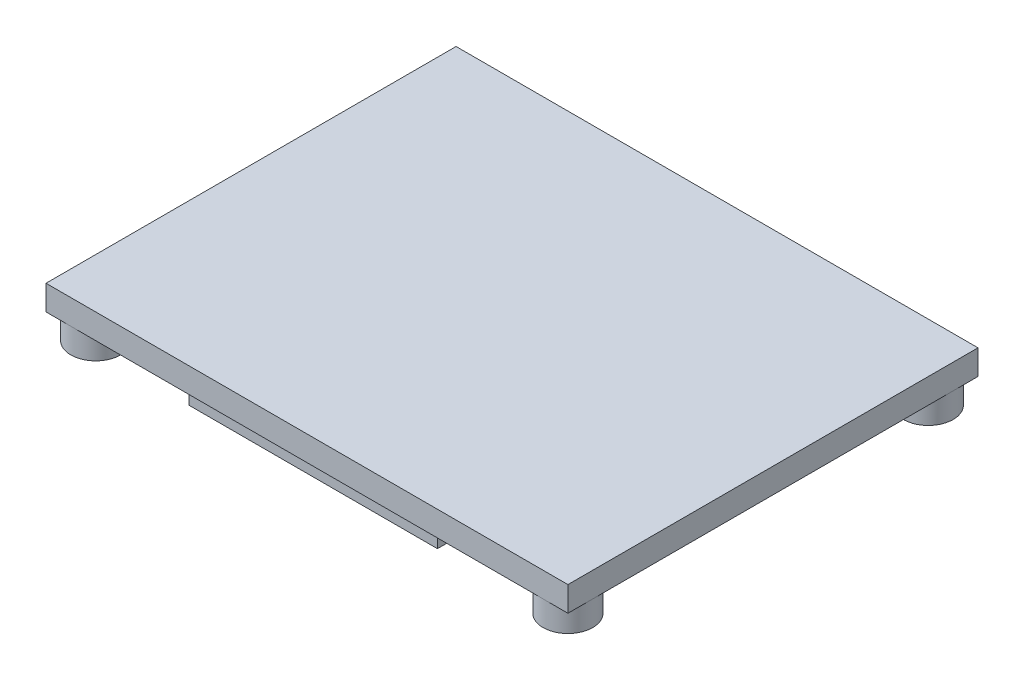
ISO-10303-21;
HEADER;
FILE_DESCRIPTION(('STEP AP214'),'2;1');
FILE_NAME('part.step','',(''),(''),'','','');
FILE_SCHEMA(('AUTOMOTIVE_DESIGN { 1 0 10303 214 1 1 1 1 }'));
ENDSEC;
DATA;
#1=APPLICATION_CONTEXT('core data for automotive mechanical design processes');
#2=APPLICATION_PROTOCOL_DEFINITION('international standard','automotive_design',2000,#1);
#3=PRODUCT_CONTEXT('',#1,'mechanical');
#4=PRODUCT('Part','Part','',(#3));
#5=PRODUCT_RELATED_PRODUCT_CATEGORY('part','',(#4));
#6=PRODUCT_DEFINITION_FORMATION('','',#4);
#7=PRODUCT_DEFINITION_CONTEXT('part definition',#1,'design');
#8=PRODUCT_DEFINITION('design','',#6,#7);
#9=PRODUCT_DEFINITION_SHAPE('','',#8);
#10=(LENGTH_UNIT() NAMED_UNIT(*) SI_UNIT(.MILLI.,.METRE.));
#11=(NAMED_UNIT(*) PLANE_ANGLE_UNIT() SI_UNIT($,.RADIAN.));
#12=(NAMED_UNIT(*) SI_UNIT($,.STERADIAN.) SOLID_ANGLE_UNIT());
#13=UNCERTAINTY_MEASURE_WITH_UNIT(LENGTH_MEASURE(1.E-05),#10,'distance_accuracy_value','');
#14=(GEOMETRIC_REPRESENTATION_CONTEXT(3) GLOBAL_UNCERTAINTY_ASSIGNED_CONTEXT((#13)) GLOBAL_UNIT_ASSIGNED_CONTEXT((#10,
#11,#12)) REPRESENTATION_CONTEXT('',''));
#15=CARTESIAN_POINT('',(0.,0.,0.));
#16=DIRECTION('',(0.,0.,1.));
#17=DIRECTION('',(1.,0.,0.));
#18=AXIS2_PLACEMENT_3D('',#15,#16,#17);
#19=CARTESIAN_POINT('',(0.,0.,0.));
#20=DIRECTION('',(0.,-1.,0.));
#21=DIRECTION('',(0.,0.,-1.));
#22=AXIS2_PLACEMENT_3D('',#19,#20,#21);
#23=PLANE('',#22);
#24=DIRECTION('',(-1.,0.,0.));
#25=VECTOR('',#24,1.);
#26=CARTESIAN_POINT('',(0.,0.,-660.));
#27=LINE('',#26,#25);
#28=CARTESIAN_POINT('',(800.,0.,-660.));
#29=VERTEX_POINT('',#28);
#30=CARTESIAN_POINT('',(40.,0.,-660.));
#31=VERTEX_POINT('',#30);
#32=EDGE_CURVE('E230',#29,#31,#27,.T.);
#33=ORIENTED_EDGE('',*,*,#32,.F.);
#34=CARTESIAN_POINT('',(800.,0.,-620.));
#35=DIRECTION('',(0.,-1.,0.));
#36=DIRECTION('',(0.,0.,-1.));
#37=AXIS2_PLACEMENT_3D('',#34,#35,#36);
#38=CIRCLE('',#37,40.);
#39=CARTESIAN_POINT('',(840.,0.,-620.));
#40=VERTEX_POINT('',#39);
#41=EDGE_CURVE('E11',#29,#40,#38,.F.);
#42=ORIENTED_EDGE('',*,*,#41,.T.);
#43=DIRECTION('',(0.,0.,-1.));
#44=VECTOR('',#43,1.);
#45=CARTESIAN_POINT('',(840.,0.,0.));
#46=LINE('',#45,#44);
#47=CARTESIAN_POINT('',(840.,0.,-40.));
#48=VERTEX_POINT('',#47);
#49=EDGE_CURVE('E226',#48,#40,#46,.T.);
#50=ORIENTED_EDGE('',*,*,#49,.F.);
#51=CARTESIAN_POINT('',(800.,0.,-40.));
#52=DIRECTION('',(0.,-1.,0.));
#53=DIRECTION('',(0.,0.,-1.));
#54=AXIS2_PLACEMENT_3D('',#51,#52,#53);
#55=CIRCLE('',#54,40.);
#56=CARTESIAN_POINT('',(800.,0.,0.));
#57=VERTEX_POINT('',#56);
#58=EDGE_CURVE('E246',#48,#57,#55,.F.);
#59=ORIENTED_EDGE('',*,*,#58,.T.);
#60=DIRECTION('',(1.,0.,0.));
#61=VECTOR('',#60,1.);
#62=CARTESIAN_POINT('',(0.,0.,0.));
#63=LINE('',#62,#61);
#64=CARTESIAN_POINT('',(40.,0.,0.));
#65=VERTEX_POINT('',#64);
#66=EDGE_CURVE('E220',#65,#57,#63,.T.);
#67=ORIENTED_EDGE('',*,*,#66,.F.);
#68=CARTESIAN_POINT('',(40.,0.,-40.));
#69=DIRECTION('',(0.,-1.,0.));
#70=DIRECTION('',(0.,0.,-1.));
#71=AXIS2_PLACEMENT_3D('',#68,#69,#70);
#72=CIRCLE('',#71,40.);
#73=CARTESIAN_POINT('',(0.,0.,-40.));
#74=VERTEX_POINT('',#73);
#75=EDGE_CURVE('E194',#74,#65,#72,.T.);
#76=ORIENTED_EDGE('',*,*,#75,.F.);
#77=DIRECTION('',(0.,0.,1.));
#78=VECTOR('',#77,1.);
#79=CARTESIAN_POINT('',(0.,0.,0.));
#80=LINE('',#79,#78);
#81=CARTESIAN_POINT('',(0.,0.,-620.));
#82=VERTEX_POINT('',#81);
#83=EDGE_CURVE('E215',#82,#74,#80,.T.);
#84=ORIENTED_EDGE('',*,*,#83,.F.);
#85=CARTESIAN_POINT('',(40.,0.,-620.));
#86=DIRECTION('',(0.,-1.,0.));
#87=DIRECTION('',(0.,0.,-1.));
#88=AXIS2_PLACEMENT_3D('',#85,#86,#87);
#89=CIRCLE('',#88,40.);
#90=EDGE_CURVE('E172',#31,#82,#89,.T.);
#91=ORIENTED_EDGE('',*,*,#90,.F.);
#92=EDGE_LOOP('',(#33,#42,#50,#59,#67,#76,#84,#91));
#93=FACE_BOUND('',#92,.T.);
#94=DIRECTION('',(0.,0.,-1.));
#95=VECTOR('',#94,1.);
#96=CARTESIAN_POINT('',(220.,0.,-10.));
#97=LINE('',#96,#95);
#98=CARTESIAN_POINT('',(220.,0.,-10.));
#99=VERTEX_POINT('',#98);
#100=CARTESIAN_POINT('',(220.,0.,-650.));
#101=VERTEX_POINT('',#100);
#102=EDGE_CURVE('E542',#99,#101,#97,.T.);
#103=ORIENTED_EDGE('',*,*,#102,.F.);
#104=DIRECTION('',(-1.,0.,0.));
#105=VECTOR('',#104,1.);
#106=CARTESIAN_POINT('',(220.,0.,-10.));
#107=LINE('',#106,#105);
#108=CARTESIAN_POINT('',(620.,0.,-9.99999999999995));
#109=VERTEX_POINT('',#108);
#110=EDGE_CURVE('E156',#109,#99,#107,.T.);
#111=ORIENTED_EDGE('',*,*,#110,.F.);
#112=DIRECTION('',(0.,0.,1.));
#113=VECTOR('',#112,1.);
#114=CARTESIAN_POINT('',(620.,0.,-9.99999999999995));
#115=LINE('',#114,#113);
#116=CARTESIAN_POINT('',(620.,0.,-650.));
#117=VERTEX_POINT('',#116);
#118=EDGE_CURVE('E152',#117,#109,#115,.T.);
#119=ORIENTED_EDGE('',*,*,#118,.F.);
#120=DIRECTION('',(1.,0.,0.));
#121=VECTOR('',#120,1.);
#122=CARTESIAN_POINT('',(620.,0.,-650.));
#123=LINE('',#122,#121);
#124=EDGE_CURVE('E538',#101,#117,#123,.T.);
#125=ORIENTED_EDGE('',*,*,#124,.F.);
#126=EDGE_LOOP('',(#103,#111,#119,#125));
#127=FACE_BOUND('',#126,.T.);
#128=ADVANCED_FACE('F43',(#93,#127),#23,.T.);
#129=CARTESIAN_POINT('',(0.,0.,-660.));
#130=VERTEX_POINT('',#129);
#131=EDGE_CURVE('E225',#31,#130,#27,.T.);
#132=ORIENTED_EDGE('',*,*,#131,.F.);
#133=CARTESIAN_POINT('',(40.,0.,-620.));
#134=DIRECTION('',(0.,-1.,0.));
#135=DIRECTION('',(0.,0.,-1.));
#136=AXIS2_PLACEMENT_3D('',#133,#134,#135);
#137=CIRCLE('',#136,40.);
#138=EDGE_CURVE('E52',#31,#82,#137,.F.);
#139=ORIENTED_EDGE('',*,*,#138,.T.);
#140=EDGE_CURVE('E210',#130,#82,#80,.T.);
#141=ORIENTED_EDGE('',*,*,#140,.F.);
#142=EDGE_LOOP('',(#132,#139,#141));
#143=FACE_BOUND('',#142,.T.);
#144=ADVANCED_FACE('F256',(#143),#23,.T.);
#145=CARTESIAN_POINT('',(840.,0.,0.));
#146=VERTEX_POINT('',#145);
#147=EDGE_CURVE('E214',#57,#146,#63,.T.);
#148=ORIENTED_EDGE('',*,*,#147,.F.);
#149=CARTESIAN_POINT('',(800.,0.,-40.));
#150=DIRECTION('',(0.,-1.,0.));
#151=DIRECTION('',(0.,0.,-1.));
#152=AXIS2_PLACEMENT_3D('',#149,#150,#151);
#153=CIRCLE('',#152,40.);
#154=EDGE_CURVE('E179',#48,#57,#153,.T.);
#155=ORIENTED_EDGE('',*,*,#154,.F.);
#156=EDGE_CURVE('E221',#146,#48,#46,.T.);
#157=ORIENTED_EDGE('',*,*,#156,.F.);
#158=EDGE_LOOP('',(#148,#155,#157));
#159=FACE_BOUND('',#158,.T.);
#160=ADVANCED_FACE('F308',(#159),#23,.T.);
#161=EDGE_CURVE('E182',#65,#74,#72,.T.);
#162=ORIENTED_EDGE('',*,*,#161,.F.);
#163=CARTESIAN_POINT('',(0.,0.,0.));
#164=VERTEX_POINT('',#163);
#165=EDGE_CURVE('E216',#164,#65,#63,.T.);
#166=ORIENTED_EDGE('',*,*,#165,.F.);
#167=EDGE_CURVE('E190',#74,#164,#80,.T.);
#168=ORIENTED_EDGE('',*,*,#167,.F.);
#169=EDGE_LOOP('',(#162,#166,#168));
#170=FACE_BOUND('',#169,.T.);
#171=ADVANCED_FACE('F282',(#170),#23,.T.);
#172=CARTESIAN_POINT('',(0.,40.,0.));
#173=DIRECTION('',(1.,0.,0.));
#174=DIRECTION('',(0.,0.,-1.));
#175=AXIS2_PLACEMENT_3D('',#172,#173,#174);
#176=PLANE('',#175);
#177=ORIENTED_EDGE('',*,*,#140,.T.);
#178=ORIENTED_EDGE('',*,*,#83,.T.);
#179=ORIENTED_EDGE('',*,*,#167,.T.);
#180=DIRECTION('',(0.,-1.,0.));
#181=VECTOR('',#180,1.);
#182=CARTESIAN_POINT('',(0.,40.,0.));
#183=LINE('',#182,#181);
#184=CARTESIAN_POINT('',(0.,40.,0.));
#185=VERTEX_POINT('',#184);
#186=EDGE_CURVE('E242',#185,#164,#183,.T.);
#187=ORIENTED_EDGE('',*,*,#186,.F.);
#188=DIRECTION('',(0.,0.,1.));
#189=VECTOR('',#188,1.);
#190=CARTESIAN_POINT('',(0.,40.,0.));
#191=LINE('',#190,#189);
#192=CARTESIAN_POINT('',(0.,40.,-660.));
#193=VERTEX_POINT('',#192);
#194=EDGE_CURVE('E195',#193,#185,#191,.T.);
#195=ORIENTED_EDGE('',*,*,#194,.F.);
#196=DIRECTION('',(0.,-1.,0.));
#197=VECTOR('',#196,1.);
#198=CARTESIAN_POINT('',(0.,40.,-660.));
#199=LINE('',#198,#197);
#200=EDGE_CURVE('E209',#193,#130,#199,.T.);
#201=ORIENTED_EDGE('',*,*,#200,.T.);
#202=EDGE_LOOP('',(#177,#178,#179,#187,#195,#201));
#203=FACE_BOUND('',#202,.T.);
#204=ADVANCED_FACE('F45',(#203),#176,.F.);
#205=CARTESIAN_POINT('',(0.,40.,0.));
#206=DIRECTION('',(0.,0.,-1.));
#207=DIRECTION('',(-1.,0.,0.));
#208=AXIS2_PLACEMENT_3D('',#205,#206,#207);
#209=PLANE('',#208);
#210=ORIENTED_EDGE('',*,*,#165,.T.);
#211=ORIENTED_EDGE('',*,*,#66,.T.);
#212=ORIENTED_EDGE('',*,*,#147,.T.);
#213=DIRECTION('',(0.,-1.,0.));
#214=VECTOR('',#213,1.);
#215=CARTESIAN_POINT('',(840.,40.,0.));
#216=LINE('',#215,#214);
#217=CARTESIAN_POINT('',(840.,40.,0.));
#218=VERTEX_POINT('',#217);
#219=EDGE_CURVE('E238',#218,#146,#216,.T.);
#220=ORIENTED_EDGE('',*,*,#219,.F.);
#221=DIRECTION('',(1.,0.,0.));
#222=VECTOR('',#221,1.);
#223=CARTESIAN_POINT('',(0.,40.,0.));
#224=LINE('',#223,#222);
#225=EDGE_CURVE('E199',#185,#218,#224,.T.);
#226=ORIENTED_EDGE('',*,*,#225,.F.);
#227=ORIENTED_EDGE('',*,*,#186,.T.);
#228=EDGE_LOOP('',(#210,#211,#212,#220,#226,#227));
#229=FACE_BOUND('',#228,.T.);
#230=ADVANCED_FACE('F305',(#229),#209,.F.);
#231=CARTESIAN_POINT('',(840.,40.,0.));
#232=DIRECTION('',(-1.,0.,0.));
#233=DIRECTION('',(0.,0.,1.));
#234=AXIS2_PLACEMENT_3D('',#231,#232,#233);
#235=PLANE('',#234);
#236=ORIENTED_EDGE('',*,*,#156,.T.);
#237=ORIENTED_EDGE('',*,*,#49,.T.);
#238=CARTESIAN_POINT('',(840.,0.,-660.));
#239=VERTEX_POINT('',#238);
#240=EDGE_CURVE('E219',#40,#239,#46,.T.);
#241=ORIENTED_EDGE('',*,*,#240,.T.);
#242=DIRECTION('',(0.,-1.,0.));
#243=VECTOR('',#242,1.);
#244=CARTESIAN_POINT('',(840.,40.,-660.));
#245=LINE('',#244,#243);
#246=CARTESIAN_POINT('',(840.,40.,-660.));
#247=VERTEX_POINT('',#246);
#248=EDGE_CURVE('E234',#247,#239,#245,.T.);
#249=ORIENTED_EDGE('',*,*,#248,.F.);
#250=DIRECTION('',(0.,0.,-1.));
#251=VECTOR('',#250,1.);
#252=CARTESIAN_POINT('',(840.,40.,0.));
#253=LINE('',#252,#251);
#254=EDGE_CURVE('E203',#218,#247,#253,.T.);
#255=ORIENTED_EDGE('',*,*,#254,.F.);
#256=ORIENTED_EDGE('',*,*,#219,.T.);
#257=EDGE_LOOP('',(#236,#237,#241,#249,#255,#256));
#258=FACE_BOUND('',#257,.T.);
#259=ADVANCED_FACE('F292',(#258),#235,.F.);
#260=CARTESIAN_POINT('',(0.,40.,-660.));
#261=DIRECTION('',(0.,0.,1.));
#262=DIRECTION('',(1.,0.,0.));
#263=AXIS2_PLACEMENT_3D('',#260,#261,#262);
#264=PLANE('',#263);
#265=EDGE_CURVE('E200',#239,#29,#27,.T.);
#266=ORIENTED_EDGE('',*,*,#265,.T.);
#267=ORIENTED_EDGE('',*,*,#32,.T.);
#268=ORIENTED_EDGE('',*,*,#131,.T.);
#269=ORIENTED_EDGE('',*,*,#200,.F.);
#270=DIRECTION('',(-1.,0.,0.));
#271=VECTOR('',#270,1.);
#272=CARTESIAN_POINT('',(0.,40.,-660.));
#273=LINE('',#272,#271);
#274=EDGE_CURVE('E206',#247,#193,#273,.T.);
#275=ORIENTED_EDGE('',*,*,#274,.F.);
#276=ORIENTED_EDGE('',*,*,#248,.T.);
#277=EDGE_LOOP('',(#266,#267,#268,#269,#275,#276));
#278=FACE_BOUND('',#277,.T.);
#279=ADVANCED_FACE('F273',(#278),#264,.F.);
#280=CARTESIAN_POINT('',(0.,40.,0.));
#281=DIRECTION('',(0.,-1.,0.));
#282=DIRECTION('',(0.,0.,-1.));
#283=AXIS2_PLACEMENT_3D('',#280,#281,#282);
#284=PLANE('',#283);
#285=ORIENTED_EDGE('',*,*,#194,.T.);
#286=ORIENTED_EDGE('',*,*,#225,.T.);
#287=ORIENTED_EDGE('',*,*,#254,.T.);
#288=ORIENTED_EDGE('',*,*,#274,.T.);
#289=EDGE_LOOP('',(#285,#286,#287,#288));
#290=FACE_BOUND('',#289,.T.);
#291=ADVANCED_FACE('F303',(#290),#284,.F.);
#292=ORIENTED_EDGE('',*,*,#240,.F.);
#293=CARTESIAN_POINT('',(800.,0.,-620.));
#294=DIRECTION('',(0.,-1.,0.));
#295=DIRECTION('',(0.,0.,-1.));
#296=AXIS2_PLACEMENT_3D('',#293,#294,#295);
#297=CIRCLE('',#296,40.);
#298=EDGE_CURVE('E164',#29,#40,#297,.T.);
#299=ORIENTED_EDGE('',*,*,#298,.F.);
#300=ORIENTED_EDGE('',*,*,#265,.F.);
#301=EDGE_LOOP('',(#292,#299,#300));
#302=FACE_BOUND('',#301,.T.);
#303=ADVANCED_FACE('F299',(#302),#23,.T.);
#304=CARTESIAN_POINT('',(40.,-40.,-40.));
#305=DIRECTION('',(0.,1.,0.));
#306=DIRECTION('',(0.,0.,1.));
#307=AXIS2_PLACEMENT_3D('',#304,#305,#306);
#308=CYLINDRICAL_SURFACE('',#307,40.);
#309=CARTESIAN_POINT('',(40.,-40.,-40.));
#310=DIRECTION('',(0.,-1.,0.));
#311=DIRECTION('',(0.,0.,-1.));
#312=AXIS2_PLACEMENT_3D('',#309,#310,#311);
#313=CIRCLE('',#312,40.);
#314=CARTESIAN_POINT('',(40.,-40.,-80.));
#315=VERTEX_POINT('',#314);
#316=EDGE_CURVE('E186',#315,#315,#313,.T.);
#317=ORIENTED_EDGE('',*,*,#316,.F.);
#318=EDGE_LOOP('',(#317));
#319=FACE_BOUND('',#318,.T.);
#320=ORIENTED_EDGE('',*,*,#161,.T.);
#321=ORIENTED_EDGE('',*,*,#75,.T.);
#322=EDGE_LOOP('',(#320,#321));
#323=FACE_BOUND('',#322,.T.);
#324=ADVANCED_FACE('F278',(#319,#323),#308,.T.);
#325=CARTESIAN_POINT('',(40.,-40.,-40.));
#326=DIRECTION('',(0.,-1.,0.));
#327=DIRECTION('',(0.,0.,-1.));
#328=AXIS2_PLACEMENT_3D('',#325,#326,#327);
#329=PLANE('',#328);
#330=ORIENTED_EDGE('',*,*,#316,.T.);
#331=EDGE_LOOP('',(#330));
#332=FACE_BOUND('',#331,.T.);
#333=ADVANCED_FACE('F313',(#332),#329,.T.);
#334=CARTESIAN_POINT('',(800.,-40.,-40.));
#335=DIRECTION('',(0.,1.,0.));
#336=DIRECTION('',(0.,0.,1.));
#337=AXIS2_PLACEMENT_3D('',#334,#335,#336);
#338=CYLINDRICAL_SURFACE('',#337,40.);
#339=CARTESIAN_POINT('',(800.,-40.,-40.));
#340=DIRECTION('',(0.,-1.,0.));
#341=DIRECTION('',(0.,0.,-1.));
#342=AXIS2_PLACEMENT_3D('',#339,#340,#341);
#343=CIRCLE('',#342,40.);
#344=CARTESIAN_POINT('',(800.,-40.,-80.));
#345=VERTEX_POINT('',#344);
#346=EDGE_CURVE('E175',#345,#345,#343,.T.);
#347=ORIENTED_EDGE('',*,*,#346,.F.);
#348=EDGE_LOOP('',(#347));
#349=FACE_BOUND('',#348,.T.);
#350=ORIENTED_EDGE('',*,*,#154,.T.);
#351=ORIENTED_EDGE('',*,*,#58,.F.);
#352=EDGE_LOOP('',(#350,#351));
#353=FACE_BOUND('',#352,.T.);
#354=ADVANCED_FACE('F310',(#349,#353),#338,.T.);
#355=CARTESIAN_POINT('',(800.,-40.,-40.));
#356=DIRECTION('',(0.,-1.,0.));
#357=DIRECTION('',(0.,0.,-1.));
#358=AXIS2_PLACEMENT_3D('',#355,#356,#357);
#359=PLANE('',#358);
#360=ORIENTED_EDGE('',*,*,#346,.T.);
#361=EDGE_LOOP('',(#360));
#362=FACE_BOUND('',#361,.T.);
#363=ADVANCED_FACE('F312',(#362),#359,.T.);
#364=CARTESIAN_POINT('',(40.,-40.,-620.));
#365=DIRECTION('',(0.,1.,0.));
#366=DIRECTION('',(0.,0.,1.));
#367=AXIS2_PLACEMENT_3D('',#364,#365,#366);
#368=CYLINDRICAL_SURFACE('',#367,40.);
#369=CARTESIAN_POINT('',(40.,-40.,-620.));
#370=DIRECTION('',(0.,-1.,0.));
#371=DIRECTION('',(0.,0.,-1.));
#372=AXIS2_PLACEMENT_3D('',#369,#370,#371);
#373=CIRCLE('',#372,40.);
#374=CARTESIAN_POINT('',(40.,-40.,-660.));
#375=VERTEX_POINT('',#374);
#376=EDGE_CURVE('E170',#375,#375,#373,.T.);
#377=ORIENTED_EDGE('',*,*,#376,.F.);
#378=EDGE_LOOP('',(#377));
#379=FACE_BOUND('',#378,.T.);
#380=ORIENTED_EDGE('',*,*,#90,.T.);
#381=ORIENTED_EDGE('',*,*,#138,.F.);
#382=EDGE_LOOP('',(#380,#381));
#383=FACE_BOUND('',#382,.T.);
#384=ADVANCED_FACE('F320',(#379,#383),#368,.T.);
#385=CARTESIAN_POINT('',(40.,-40.,-620.));
#386=DIRECTION('',(0.,-1.,0.));
#387=DIRECTION('',(0.,0.,-1.));
#388=AXIS2_PLACEMENT_3D('',#385,#386,#387);
#389=PLANE('',#388);
#390=ORIENTED_EDGE('',*,*,#376,.T.);
#391=EDGE_LOOP('',(#390));
#392=FACE_BOUND('',#391,.T.);
#393=ADVANCED_FACE('F435',(#392),#389,.T.);
#394=CARTESIAN_POINT('',(800.,-40.,-620.));
#395=DIRECTION('',(0.,1.,0.));
#396=DIRECTION('',(0.,0.,1.));
#397=AXIS2_PLACEMENT_3D('',#394,#395,#396);
#398=CYLINDRICAL_SURFACE('',#397,40.);
#399=CARTESIAN_POINT('',(800.,-40.,-620.));
#400=DIRECTION('',(0.,-1.,0.));
#401=DIRECTION('',(0.,0.,-1.));
#402=AXIS2_PLACEMENT_3D('',#399,#400,#401);
#403=CIRCLE('',#402,40.);
#404=CARTESIAN_POINT('',(800.,-40.,-660.));
#405=VERTEX_POINT('',#404);
#406=EDGE_CURVE('E159',#405,#405,#403,.T.);
#407=ORIENTED_EDGE('',*,*,#406,.F.);
#408=EDGE_LOOP('',(#407));
#409=FACE_BOUND('',#408,.T.);
#410=ORIENTED_EDGE('',*,*,#298,.T.);
#411=ORIENTED_EDGE('',*,*,#41,.F.);
#412=EDGE_LOOP('',(#410,#411));
#413=FACE_BOUND('',#412,.T.);
#414=ADVANCED_FACE('F446',(#409,#413),#398,.T.);
#415=CARTESIAN_POINT('',(800.,-40.,-620.));
#416=DIRECTION('',(0.,-1.,0.));
#417=DIRECTION('',(0.,0.,-1.));
#418=AXIS2_PLACEMENT_3D('',#415,#416,#417);
#419=PLANE('',#418);
#420=ORIENTED_EDGE('',*,*,#406,.T.);
#421=EDGE_LOOP('',(#420));
#422=FACE_BOUND('',#421,.T.);
#423=ADVANCED_FACE('F456',(#422),#419,.T.);
#424=CARTESIAN_POINT('',(220.,-25.,-10.));
#425=DIRECTION('',(0.,0.,-1.));
#426=DIRECTION('',(-1.,0.,0.));
#427=AXIS2_PLACEMENT_3D('',#424,#425,#426);
#428=PLANE('',#427);
#429=ORIENTED_EDGE('',*,*,#110,.T.);
#430=DIRECTION('',(0.,1.,0.));
#431=VECTOR('',#430,1.);
#432=CARTESIAN_POINT('',(220.,-25.,-10.));
#433=LINE('',#432,#431);
#434=CARTESIAN_POINT('',(220.,-25.,-10.));
#435=VERTEX_POINT('',#434);
#436=EDGE_CURVE('E135',#435,#99,#433,.T.);
#437=ORIENTED_EDGE('',*,*,#436,.F.);
#438=DIRECTION('',(-1.,0.,0.));
#439=VECTOR('',#438,1.);
#440=CARTESIAN_POINT('',(220.,-25.,-10.));
#441=LINE('',#440,#439);
#442=CARTESIAN_POINT('',(620.,-25.,-9.99999999999995));
#443=VERTEX_POINT('',#442);
#444=EDGE_CURVE('E143',#443,#435,#441,.T.);
#445=ORIENTED_EDGE('',*,*,#444,.F.);
#446=DIRECTION('',(0.,1.,0.));
#447=VECTOR('',#446,1.);
#448=CARTESIAN_POINT('',(620.,-25.,-9.99999999999995));
#449=LINE('',#448,#447);
#450=EDGE_CURVE('E535',#443,#109,#449,.T.);
#451=ORIENTED_EDGE('',*,*,#450,.T.);
#452=EDGE_LOOP('',(#429,#437,#445,#451));
#453=FACE_BOUND('',#452,.T.);
#454=ADVANCED_FACE('F154',(#453),#428,.F.);
#455=CARTESIAN_POINT('',(220.,-25.,-10.));
#456=DIRECTION('',(1.,0.,0.));
#457=DIRECTION('',(0.,0.,-1.));
#458=AXIS2_PLACEMENT_3D('',#455,#456,#457);
#459=PLANE('',#458);
#460=ORIENTED_EDGE('',*,*,#102,.T.);
#461=DIRECTION('',(0.,1.,0.));
#462=VECTOR('',#461,1.);
#463=CARTESIAN_POINT('',(220.,-25.,-650.));
#464=LINE('',#463,#462);
#465=CARTESIAN_POINT('',(220.,-25.,-650.));
#466=VERTEX_POINT('',#465);
#467=EDGE_CURVE('E138',#466,#101,#464,.T.);
#468=ORIENTED_EDGE('',*,*,#467,.F.);
#469=DIRECTION('',(0.,0.,-1.));
#470=VECTOR('',#469,1.);
#471=CARTESIAN_POINT('',(220.,-25.,-10.));
#472=LINE('',#471,#470);
#473=EDGE_CURVE('E131',#435,#466,#472,.T.);
#474=ORIENTED_EDGE('',*,*,#473,.F.);
#475=ORIENTED_EDGE('',*,*,#436,.T.);
#476=EDGE_LOOP('',(#460,#468,#474,#475));
#477=FACE_BOUND('',#476,.T.);
#478=ADVANCED_FACE('F133',(#477),#459,.F.);
#479=CARTESIAN_POINT('',(620.,-25.,-650.));
#480=DIRECTION('',(0.,0.,1.));
#481=DIRECTION('',(1.,0.,0.));
#482=AXIS2_PLACEMENT_3D('',#479,#480,#481);
#483=PLANE('',#482);
#484=ORIENTED_EDGE('',*,*,#124,.T.);
#485=DIRECTION('',(0.,1.,0.));
#486=VECTOR('',#485,1.);
#487=CARTESIAN_POINT('',(620.,-25.,-650.));
#488=LINE('',#487,#486);
#489=CARTESIAN_POINT('',(620.,-25.,-650.));
#490=VERTEX_POINT('',#489);
#491=EDGE_CURVE('E59',#490,#117,#488,.T.);
#492=ORIENTED_EDGE('',*,*,#491,.F.);
#493=DIRECTION('',(1.,0.,0.));
#494=VECTOR('',#493,1.);
#495=CARTESIAN_POINT('',(620.,-25.,-650.));
#496=LINE('',#495,#494);
#497=EDGE_CURVE('E142',#466,#490,#496,.T.);
#498=ORIENTED_EDGE('',*,*,#497,.F.);
#499=ORIENTED_EDGE('',*,*,#467,.T.);
#500=EDGE_LOOP('',(#484,#492,#498,#499));
#501=FACE_BOUND('',#500,.T.);
#502=ADVANCED_FACE('F492',(#501),#483,.F.);
#503=CARTESIAN_POINT('',(620.,-25.,-9.99999999999995));
#504=DIRECTION('',(-1.,0.,0.));
#505=DIRECTION('',(0.,0.,1.));
#506=AXIS2_PLACEMENT_3D('',#503,#504,#505);
#507=PLANE('',#506);
#508=ORIENTED_EDGE('',*,*,#118,.T.);
#509=ORIENTED_EDGE('',*,*,#450,.F.);
#510=DIRECTION('',(0.,0.,1.));
#511=VECTOR('',#510,1.);
#512=CARTESIAN_POINT('',(620.,-25.,-9.99999999999995));
#513=LINE('',#512,#511);
#514=EDGE_CURVE('E147',#490,#443,#513,.T.);
#515=ORIENTED_EDGE('',*,*,#514,.F.);
#516=ORIENTED_EDGE('',*,*,#491,.T.);
#517=EDGE_LOOP('',(#508,#509,#515,#516));
#518=FACE_BOUND('',#517,.T.);
#519=ADVANCED_FACE('F502',(#518),#507,.F.);
#520=CARTESIAN_POINT('',(0.,-25.,0.));
#521=DIRECTION('',(0.,1.,0.));
#522=DIRECTION('',(0.,0.,1.));
#523=AXIS2_PLACEMENT_3D('',#520,#521,#522);
#524=PLANE('',#523);
#525=ORIENTED_EDGE('',*,*,#444,.T.);
#526=ORIENTED_EDGE('',*,*,#473,.T.);
#527=ORIENTED_EDGE('',*,*,#497,.T.);
#528=ORIENTED_EDGE('',*,*,#514,.T.);
#529=EDGE_LOOP('',(#525,#526,#527,#528));
#530=FACE_BOUND('',#529,.T.);
#531=ADVANCED_FACE('F146',(#530),#524,.F.);
#532=CLOSED_SHELL('',(#128,#144,#160,#171,#204,#230,#259,#279,#291,#303,#324,#333,#354,#363,
#384,#393,#414,#423,#454,#478,#502,#519,#531));
#533=MANIFOLD_SOLID_BREP('B2',#532);
#534=ADVANCED_BREP_SHAPE_REPRESENTATION('',(#18,#533),#14);
#535=SHAPE_DEFINITION_REPRESENTATION(#9,#534);
ENDSEC;
END-ISO-10303-21;
